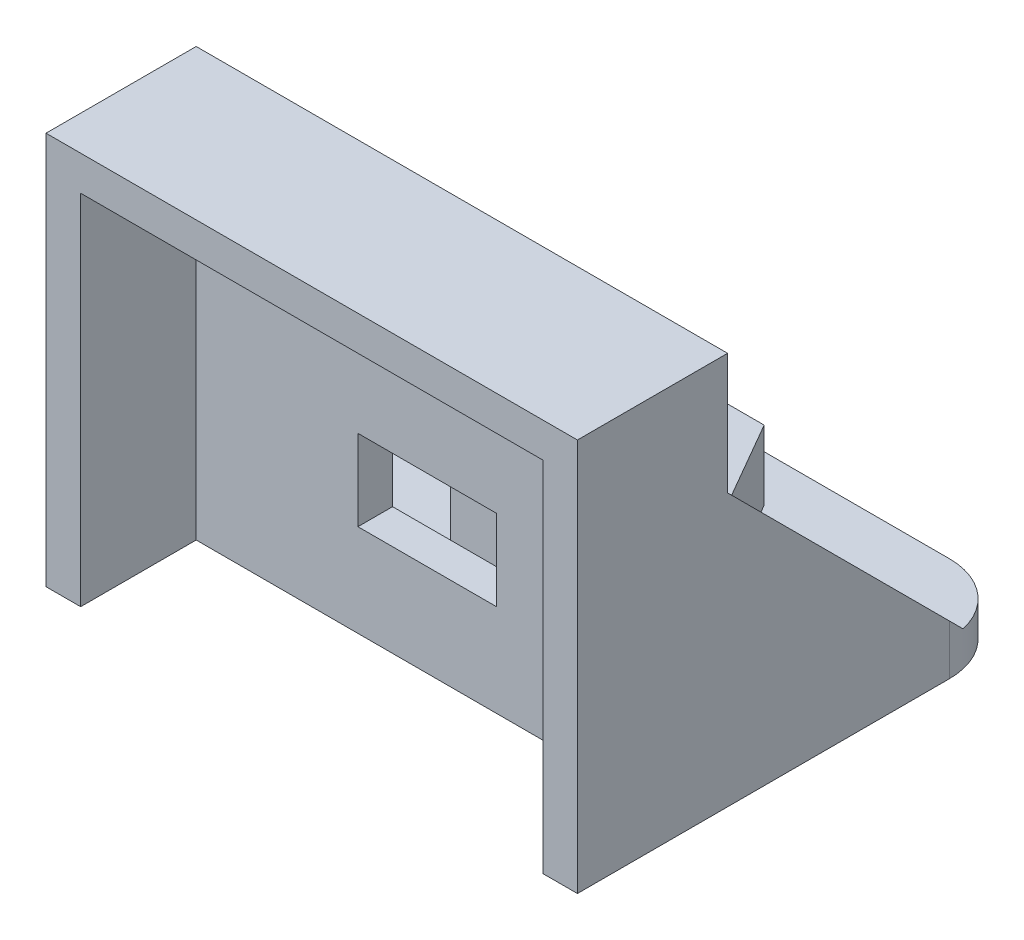
ISO-10303-21;
HEADER;
FILE_DESCRIPTION(('STEP AP214'),'2;1');
FILE_NAME('part.step','',(''),(''),'','','');
FILE_SCHEMA(('AUTOMOTIVE_DESIGN { 1 0 10303 214 1 1 1 1 }'));
ENDSEC;
DATA;
#1=APPLICATION_CONTEXT('core data for automotive mechanical design processes');
#2=APPLICATION_PROTOCOL_DEFINITION('international standard','automotive_design',2000,#1);
#3=PRODUCT_CONTEXT('',#1,'mechanical');
#4=PRODUCT('Part','Part','',(#3));
#5=PRODUCT_RELATED_PRODUCT_CATEGORY('part','',(#4));
#6=PRODUCT_DEFINITION_FORMATION('','',#4);
#7=PRODUCT_DEFINITION_CONTEXT('part definition',#1,'design');
#8=PRODUCT_DEFINITION('design','',#6,#7);
#9=PRODUCT_DEFINITION_SHAPE('','',#8);
#10=(LENGTH_UNIT() NAMED_UNIT(*) SI_UNIT(.MILLI.,.METRE.));
#11=(NAMED_UNIT(*) PLANE_ANGLE_UNIT() SI_UNIT($,.RADIAN.));
#12=(NAMED_UNIT(*) SI_UNIT($,.STERADIAN.) SOLID_ANGLE_UNIT());
#13=UNCERTAINTY_MEASURE_WITH_UNIT(LENGTH_MEASURE(1.E-05),#10,'distance_accuracy_value','');
#14=(GEOMETRIC_REPRESENTATION_CONTEXT(3) GLOBAL_UNCERTAINTY_ASSIGNED_CONTEXT((#13)) GLOBAL_UNIT_ASSIGNED_CONTEXT((#10,
#11,#12)) REPRESENTATION_CONTEXT('',''));
#15=CARTESIAN_POINT('',(0.,0.,0.));
#16=DIRECTION('',(0.,0.,1.));
#17=DIRECTION('',(1.,0.,0.));
#18=AXIS2_PLACEMENT_3D('',#15,#16,#17);
#19=CARTESIAN_POINT('',(11.5,-7.,-12.6));
#20=DIRECTION('',(0.,-1.,0.));
#21=DIRECTION('',(0.,0.,-1.));
#22=AXIS2_PLACEMENT_3D('',#19,#20,#21);
#23=PLANE('',#22);
#24=DIRECTION('',(0.5,0.,-0.866025403784439));
#25=VECTOR('',#24,1.);
#26=CARTESIAN_POINT('',(2.4826061575154,-7.,-2.));
#27=LINE('',#26,#25);
#28=CARTESIAN_POINT('',(2.4826061575154,-7.,-2.));
#29=VERTEX_POINT('',#28);
#30=CARTESIAN_POINT('',(4.96521231503081,-7.,-6.30000000000002));
#31=VERTEX_POINT('',#30);
#32=EDGE_CURVE('E357',#29,#31,#27,.T.);
#33=ORIENTED_EDGE('',*,*,#32,.F.);
#34=DIRECTION('',(1.,0.,0.));
#35=VECTOR('',#34,1.);
#36=CARTESIAN_POINT('',(-2.48260615751541,-7.,-2.));
#37=LINE('',#36,#35);
#38=CARTESIAN_POINT('',(-2.48260615751541,-7.,-2.));
#39=VERTEX_POINT('',#38);
#40=EDGE_CURVE('E362',#39,#29,#37,.T.);
#41=ORIENTED_EDGE('',*,*,#40,.F.);
#42=DIRECTION('',(0.5,0.,0.866025403784439));
#43=VECTOR('',#42,1.);
#44=CARTESIAN_POINT('',(-4.96521231503081,-7.,-6.30000000000003));
#45=LINE('',#44,#43);
#46=CARTESIAN_POINT('',(-4.96521231503081,-7.,-6.30000000000003));
#47=VERTEX_POINT('',#46);
#48=EDGE_CURVE('E384',#47,#39,#45,.T.);
#49=ORIENTED_EDGE('',*,*,#48,.F.);
#50=DIRECTION('',(-0.5,0.,0.866025403784439));
#51=VECTOR('',#50,1.);
#52=CARTESIAN_POINT('',(-2.48260615751541,-7.,-10.6));
#53=LINE('',#52,#51);
#54=CARTESIAN_POINT('',(-2.48260615751541,-7.,-10.6));
#55=VERTEX_POINT('',#54);
#56=EDGE_CURVE('E381',#55,#47,#53,.T.);
#57=ORIENTED_EDGE('',*,*,#56,.F.);
#58=DIRECTION('',(-1.,0.,0.));
#59=VECTOR('',#58,1.);
#60=CARTESIAN_POINT('',(2.4826061575154,-7.,-10.6));
#61=LINE('',#60,#59);
#62=CARTESIAN_POINT('',(2.4826061575154,-7.,-10.6));
#63=VERTEX_POINT('',#62);
#64=EDGE_CURVE('E378',#63,#55,#61,.T.);
#65=ORIENTED_EDGE('',*,*,#64,.F.);
#66=DIRECTION('',(-0.5,0.,-0.866025403784439));
#67=VECTOR('',#66,1.);
#68=CARTESIAN_POINT('',(4.96521231503081,-7.,-6.30000000000002));
#69=LINE('',#68,#67);
#70=EDGE_CURVE('E375',#31,#63,#69,.T.);
#71=ORIENTED_EDGE('',*,*,#70,.F.);
#72=EDGE_LOOP('',(#33,#41,#49,#57,#65,#71));
#73=FACE_BOUND('',#72,.T.);
#74=DIRECTION('',(1.,0.,0.));
#75=VECTOR('',#74,1.);
#76=CARTESIAN_POINT('',(11.5,-7.,-12.6));
#77=LINE('',#76,#75);
#78=CARTESIAN_POINT('',(-8.5,-7.,-12.6));
#79=VERTEX_POINT('',#78);
#80=CARTESIAN_POINT('',(8.5,-7.,-12.6));
#81=VERTEX_POINT('',#80);
#82=EDGE_CURVE('E410',#79,#81,#77,.T.);
#83=ORIENTED_EDGE('',*,*,#82,.F.);
#84=CARTESIAN_POINT('',(-8.5,-7.,-9.6));
#85=DIRECTION('',(0.,-1.,0.));
#86=DIRECTION('',(0.,0.,-1.));
#87=AXIS2_PLACEMENT_3D('',#84,#85,#86);
#88=CIRCLE('',#87,3.);
#89=CARTESIAN_POINT('',(-11.4249141286952,-7.,-10.2669912591324));
#90=VERTEX_POINT('',#89);
#91=EDGE_CURVE('E481',#79,#90,#88,.F.);
#92=ORIENTED_EDGE('',*,*,#91,.T.);
#93=DIRECTION('',(-1.,0.,0.));
#94=VECTOR('',#93,1.);
#95=CARTESIAN_POINT('',(-10.,-7.,-10.2669912591324));
#96=LINE('',#95,#94);
#97=CARTESIAN_POINT('',(-10.,-7.,-10.2669912591324));
#98=VERTEX_POINT('',#97);
#99=EDGE_CURVE('E285',#98,#90,#96,.T.);
#100=ORIENTED_EDGE('',*,*,#99,.F.);
#101=DIRECTION('',(0.,0.,-1.));
#102=VECTOR('',#101,1.);
#103=CARTESIAN_POINT('',(-10.,-7.,-8.894310991121));
#104=LINE('',#103,#102);
#105=CARTESIAN_POINT('',(-10.,-7.00000000000001,0.));
#106=VERTEX_POINT('',#105);
#107=EDGE_CURVE('E288',#106,#98,#104,.T.);
#108=ORIENTED_EDGE('',*,*,#107,.F.);
#109=DIRECTION('',(1.,0.,0.));
#110=VECTOR('',#109,1.);
#111=CARTESIAN_POINT('',(11.5,-7.,0.));
#112=LINE('',#111,#110);
#113=CARTESIAN_POINT('',(10.,-7.,0.));
#114=VERTEX_POINT('',#113);
#115=EDGE_CURVE('E406',#106,#114,#112,.T.);
#116=ORIENTED_EDGE('',*,*,#115,.T.);
#117=DIRECTION('',(0.,0.,-1.));
#118=VECTOR('',#117,1.);
#119=CARTESIAN_POINT('',(10.,-7.,-8.894310991121));
#120=LINE('',#119,#118);
#121=CARTESIAN_POINT('',(10.,-7.,-10.2669912591324));
#122=VERTEX_POINT('',#121);
#123=EDGE_CURVE('E301',#114,#122,#120,.T.);
#124=ORIENTED_EDGE('',*,*,#123,.T.);
#125=DIRECTION('',(1.,0.,0.));
#126=VECTOR('',#125,1.);
#127=CARTESIAN_POINT('',(10.,-7.,-10.2669912591324));
#128=LINE('',#127,#126);
#129=CARTESIAN_POINT('',(11.4249141286952,-7.,-10.2669912591324));
#130=VERTEX_POINT('',#129);
#131=EDGE_CURVE('E304',#122,#130,#128,.T.);
#132=ORIENTED_EDGE('',*,*,#131,.T.);
#133=CARTESIAN_POINT('',(8.5,-7.,-9.6));
#134=DIRECTION('',(0.,-1.,0.));
#135=DIRECTION('',(0.,0.,-1.));
#136=AXIS2_PLACEMENT_3D('',#133,#134,#135);
#137=CIRCLE('',#136,3.);
#138=EDGE_CURVE('E479',#130,#81,#137,.F.);
#139=ORIENTED_EDGE('',*,*,#138,.T.);
#140=EDGE_LOOP('',(#83,#92,#100,#108,#116,#124,#132,#139));
#141=FACE_BOUND('',#140,.T.);
#142=ADVANCED_FACE('F33',(#73,#141),#23,.F.);
#143=CARTESIAN_POINT('',(0.,0.,0.));
#144=DIRECTION('',(0.,0.,1.));
#145=DIRECTION('',(1.,0.,0.));
#146=AXIS2_PLACEMENT_3D('',#143,#144,#145);
#147=PLANE('',#146);
#148=DIRECTION('',(-1.,0.,0.));
#149=VECTOR('',#148,1.);
#150=CARTESIAN_POINT('',(2.99999999999999,-4.5,0.));
#151=LINE('',#150,#149);
#152=CARTESIAN_POINT('',(2.99999999999999,-4.5,0.));
#153=VERTEX_POINT('',#152);
#154=CARTESIAN_POINT('',(-3.00000000000001,-4.5,0.));
#155=VERTEX_POINT('',#154);
#156=EDGE_CURVE('E260',#153,#155,#151,.T.);
#157=ORIENTED_EDGE('',*,*,#156,.F.);
#158=DIRECTION('',(0.,-1.,0.));
#159=VECTOR('',#158,1.);
#160=CARTESIAN_POINT('',(2.99999999999999,-1.,0.));
#161=LINE('',#160,#159);
#162=CARTESIAN_POINT('',(2.99999999999999,-1.,0.));
#163=VERTEX_POINT('',#162);
#164=EDGE_CURVE('E48',#163,#153,#161,.T.);
#165=ORIENTED_EDGE('',*,*,#164,.F.);
#166=DIRECTION('',(1.,0.,0.));
#167=VECTOR('',#166,1.);
#168=CARTESIAN_POINT('',(2.99999999999999,-1.,0.));
#169=LINE('',#168,#167);
#170=CARTESIAN_POINT('',(-3.00000000000001,-1.,0.));
#171=VERTEX_POINT('',#170);
#172=EDGE_CURVE('E253',#171,#163,#169,.T.);
#173=ORIENTED_EDGE('',*,*,#172,.F.);
#174=DIRECTION('',(0.,1.,0.));
#175=VECTOR('',#174,1.);
#176=CARTESIAN_POINT('',(-3.00000000000001,-1.,0.));
#177=LINE('',#176,#175);
#178=EDGE_CURVE('E267',#155,#171,#177,.T.);
#179=ORIENTED_EDGE('',*,*,#178,.F.);
#180=EDGE_LOOP('',(#157,#165,#173,#179));
#181=FACE_BOUND('',#180,.T.);
#182=DIRECTION('',(0.,1.,0.));
#183=VECTOR('',#182,1.);
#184=CARTESIAN_POINT('',(-10.,1.89431099112099,0.));
#185=LINE('',#184,#183);
#186=CARTESIAN_POINT('',(-10.,3.26699125913235,0.));
#187=VERTEX_POINT('',#186);
#188=EDGE_CURVE('E281',#106,#187,#185,.T.);
#189=ORIENTED_EDGE('',*,*,#188,.T.);
#190=DIRECTION('',(-1.,0.,0.));
#191=VECTOR('',#190,1.);
#192=CARTESIAN_POINT('',(-10.,3.26699125913235,0.));
#193=LINE('',#192,#191);
#194=CARTESIAN_POINT('',(-11.5,3.26699125913235,0.));
#195=VERTEX_POINT('',#194);
#196=EDGE_CURVE('E282',#187,#195,#193,.T.);
#197=ORIENTED_EDGE('',*,*,#196,.T.);
#198=DIRECTION('',(0.,-1.,0.));
#199=VECTOR('',#198,1.);
#200=CARTESIAN_POINT('',(-11.5,8.5,0.));
#201=LINE('',#200,#199);
#202=CARTESIAN_POINT('',(-11.5,8.5,0.));
#203=VERTEX_POINT('',#202);
#204=EDGE_CURVE('E448',#203,#195,#201,.T.);
#205=ORIENTED_EDGE('',*,*,#204,.F.);
#206=DIRECTION('',(-1.,0.,0.));
#207=VECTOR('',#206,1.);
#208=CARTESIAN_POINT('',(-11.5,8.5,0.));
#209=LINE('',#208,#207);
#210=CARTESIAN_POINT('',(11.5,8.5,0.));
#211=VERTEX_POINT('',#210);
#212=EDGE_CURVE('E458',#211,#203,#209,.T.);
#213=ORIENTED_EDGE('',*,*,#212,.F.);
#214=DIRECTION('',(0.,1.,0.));
#215=VECTOR('',#214,1.);
#216=CARTESIAN_POINT('',(11.5,8.5,0.));
#217=LINE('',#216,#215);
#218=CARTESIAN_POINT('',(11.5,3.26699125913235,0.));
#219=VERTEX_POINT('',#218);
#220=EDGE_CURVE('E436',#219,#211,#217,.T.);
#221=ORIENTED_EDGE('',*,*,#220,.F.);
#222=DIRECTION('',(1.,0.,0.));
#223=VECTOR('',#222,1.);
#224=CARTESIAN_POINT('',(10.,3.26699125913235,0.));
#225=LINE('',#224,#223);
#226=CARTESIAN_POINT('',(10.,3.26699125913235,0.));
#227=VERTEX_POINT('',#226);
#228=EDGE_CURVE('E297',#227,#219,#225,.T.);
#229=ORIENTED_EDGE('',*,*,#228,.F.);
#230=DIRECTION('',(0.,1.,0.));
#231=VECTOR('',#230,1.);
#232=CARTESIAN_POINT('',(10.,1.89431099112099,0.));
#233=LINE('',#232,#231);
#234=EDGE_CURVE('E298',#114,#227,#233,.T.);
#235=ORIENTED_EDGE('',*,*,#234,.F.);
#236=ORIENTED_EDGE('',*,*,#115,.F.);
#237=EDGE_LOOP('',(#189,#197,#205,#213,#221,#229,#235,#236));
#238=FACE_BOUND('',#237,.T.);
#239=ADVANCED_FACE('F527',(#181,#238),#147,.F.);
#240=CARTESIAN_POINT('',(11.5,8.5,6.5));
#241=DIRECTION('',(-1.,0.,0.));
#242=DIRECTION('',(0.,-1.,0.));
#243=AXIS2_PLACEMENT_3D('',#240,#241,#242);
#244=PLANE('',#243);
#245=DIRECTION('',(0.,0.,-1.));
#246=VECTOR('',#245,1.);
#247=CARTESIAN_POINT('',(11.5,-8.5,6.5));
#248=LINE('',#247,#246);
#249=CARTESIAN_POINT('',(11.5,-8.5,6.5));
#250=VERTEX_POINT('',#249);
#251=CARTESIAN_POINT('',(11.5,-8.5,-9.59999999999999));
#252=VERTEX_POINT('',#251);
#253=EDGE_CURVE('E456',#250,#252,#248,.T.);
#254=ORIENTED_EDGE('',*,*,#253,.T.);
#255=DIRECTION('',(0.,-1.,0.));
#256=VECTOR('',#255,1.);
#257=CARTESIAN_POINT('',(11.5,-7.,-9.6));
#258=LINE('',#257,#256);
#259=CARTESIAN_POINT('',(11.5,-6.33300874086764,-9.6));
#260=VERTEX_POINT('',#259);
#261=EDGE_CURVE('E41',#252,#260,#258,.F.);
#262=ORIENTED_EDGE('',*,*,#261,.T.);
#263=DIRECTION('',(0.,0.707106781186547,0.707106781186548));
#264=VECTOR('',#263,1.);
#265=CARTESIAN_POINT('',(11.5,-10.7608153615548,-14.0278066206872));
#266=LINE('',#265,#264);
#267=EDGE_CURVE('E307',#260,#219,#266,.T.);
#268=ORIENTED_EDGE('',*,*,#267,.T.);
#269=ORIENTED_EDGE('',*,*,#220,.T.);
#270=DIRECTION('',(0.,0.,-1.));
#271=VECTOR('',#270,1.);
#272=CARTESIAN_POINT('',(11.5,8.5,6.5));
#273=LINE('',#272,#271);
#274=CARTESIAN_POINT('',(11.5,8.5,6.5));
#275=VERTEX_POINT('',#274);
#276=EDGE_CURVE('E470',#275,#211,#273,.T.);
#277=ORIENTED_EDGE('',*,*,#276,.F.);
#278=DIRECTION('',(0.,1.,0.));
#279=VECTOR('',#278,1.);
#280=CARTESIAN_POINT('',(11.5,8.5,6.5));
#281=LINE('',#280,#279);
#282=EDGE_CURVE('E444',#250,#275,#281,.T.);
#283=ORIENTED_EDGE('',*,*,#282,.F.);
#284=EDGE_LOOP('',(#254,#262,#268,#269,#277,#283));
#285=FACE_BOUND('',#284,.T.);
#286=ADVANCED_FACE('F493',(#285),#244,.F.);
#287=CARTESIAN_POINT('',(-11.5,8.5,6.5));
#288=DIRECTION('',(0.,-1.,0.));
#289=DIRECTION('',(0.,0.,-1.));
#290=AXIS2_PLACEMENT_3D('',#287,#288,#289);
#291=PLANE('',#290);
#292=ORIENTED_EDGE('',*,*,#212,.T.);
#293=DIRECTION('',(0.,0.,-1.));
#294=VECTOR('',#293,1.);
#295=CARTESIAN_POINT('',(-11.5,8.5,6.5));
#296=LINE('',#295,#294);
#297=CARTESIAN_POINT('',(-11.5,8.5,6.5));
#298=VERTEX_POINT('',#297);
#299=EDGE_CURVE('E467',#298,#203,#296,.T.);
#300=ORIENTED_EDGE('',*,*,#299,.F.);
#301=DIRECTION('',(-1.,0.,0.));
#302=VECTOR('',#301,1.);
#303=CARTESIAN_POINT('',(-11.5,8.5,6.5));
#304=LINE('',#303,#302);
#305=EDGE_CURVE('E447',#275,#298,#304,.T.);
#306=ORIENTED_EDGE('',*,*,#305,.F.);
#307=ORIENTED_EDGE('',*,*,#276,.T.);
#308=EDGE_LOOP('',(#292,#300,#306,#307));
#309=FACE_BOUND('',#308,.T.);
#310=ADVANCED_FACE('F659',(#309),#291,.F.);
#311=CARTESIAN_POINT('',(-11.5,8.5,6.5));
#312=DIRECTION('',(1.,0.,0.));
#313=DIRECTION('',(0.,1.,0.));
#314=AXIS2_PLACEMENT_3D('',#311,#312,#313);
#315=PLANE('',#314);
#316=DIRECTION('',(0.,0.707106781186547,0.707106781186548));
#317=VECTOR('',#316,1.);
#318=CARTESIAN_POINT('',(-11.5,-10.7608153615548,-14.0278066206872));
#319=LINE('',#318,#317);
#320=CARTESIAN_POINT('',(-11.5,-6.33300874086764,-9.6));
#321=VERTEX_POINT('',#320);
#322=EDGE_CURVE('E292',#321,#195,#319,.T.);
#323=ORIENTED_EDGE('',*,*,#322,.F.);
#324=DIRECTION('',(0.,1.,0.));
#325=VECTOR('',#324,1.);
#326=CARTESIAN_POINT('',(-11.5,-8.5,-9.6));
#327=LINE('',#326,#325);
#328=CARTESIAN_POINT('',(-11.5,-8.5,-9.59999999999999));
#329=VERTEX_POINT('',#328);
#330=EDGE_CURVE('E485',#321,#329,#327,.F.);
#331=ORIENTED_EDGE('',*,*,#330,.T.);
#332=DIRECTION('',(0.,0.,-1.));
#333=VECTOR('',#332,1.);
#334=CARTESIAN_POINT('',(-11.5,-8.5,6.5));
#335=LINE('',#334,#333);
#336=CARTESIAN_POINT('',(-11.5,-8.5,6.5));
#337=VERTEX_POINT('',#336);
#338=EDGE_CURVE('E464',#337,#329,#335,.T.);
#339=ORIENTED_EDGE('',*,*,#338,.F.);
#340=DIRECTION('',(0.,-1.,0.));
#341=VECTOR('',#340,1.);
#342=CARTESIAN_POINT('',(-11.5,8.5,6.5));
#343=LINE('',#342,#341);
#344=EDGE_CURVE('E450',#298,#337,#343,.T.);
#345=ORIENTED_EDGE('',*,*,#344,.F.);
#346=ORIENTED_EDGE('',*,*,#299,.T.);
#347=ORIENTED_EDGE('',*,*,#204,.T.);
#348=EDGE_LOOP('',(#323,#331,#339,#345,#346,#347));
#349=FACE_BOUND('',#348,.T.);
#350=ADVANCED_FACE('F655',(#349),#315,.F.);
#351=CARTESIAN_POINT('',(-11.5,-8.5,6.5));
#352=DIRECTION('',(0.,1.,0.));
#353=DIRECTION('',(0.,0.,1.));
#354=AXIS2_PLACEMENT_3D('',#351,#352,#353);
#355=PLANE('',#354);
#356=CARTESIAN_POINT('',(0.,-8.5,-6.30000000000002));
#357=DIRECTION('',(0.,1.,0.));
#358=DIRECTION('',(0.,0.,1.));
#359=AXIS2_PLACEMENT_3D('',#356,#357,#358);
#360=CIRCLE('',#359,1.6);
#361=CARTESIAN_POINT('',(0.,-8.5,-4.70000000000003));
#362=VERTEX_POINT('',#361);
#363=EDGE_CURVE('E278',#362,#362,#360,.T.);
#364=ORIENTED_EDGE('',*,*,#363,.T.);
#365=EDGE_LOOP('',(#364));
#366=FACE_BOUND('',#365,.T.);
#367=ORIENTED_EDGE('',*,*,#338,.T.);
#368=CARTESIAN_POINT('',(-8.5,-8.5,-9.6));
#369=DIRECTION('',(0.,1.,0.));
#370=DIRECTION('',(0.,0.,1.));
#371=AXIS2_PLACEMENT_3D('',#368,#369,#370);
#372=CIRCLE('',#371,3.);
#373=CARTESIAN_POINT('',(-8.5,-8.5,-12.6));
#374=VERTEX_POINT('',#373);
#375=EDGE_CURVE('E489',#329,#374,#372,.F.);
#376=ORIENTED_EDGE('',*,*,#375,.T.);
#377=DIRECTION('',(-1.,0.,0.));
#378=VECTOR('',#377,1.);
#379=CARTESIAN_POINT('',(11.5,-8.5,-12.6));
#380=LINE('',#379,#378);
#381=CARTESIAN_POINT('',(8.5,-8.5,-12.6));
#382=VERTEX_POINT('',#381);
#383=EDGE_CURVE('E407',#382,#374,#380,.T.);
#384=ORIENTED_EDGE('',*,*,#383,.F.);
#385=CARTESIAN_POINT('',(8.5,-8.5,-9.6));
#386=DIRECTION('',(0.,1.,0.));
#387=DIRECTION('',(0.,0.,1.));
#388=AXIS2_PLACEMENT_3D('',#385,#386,#387);
#389=CIRCLE('',#388,3.);
#390=EDGE_CURVE('E487',#382,#252,#389,.F.);
#391=ORIENTED_EDGE('',*,*,#390,.T.);
#392=ORIENTED_EDGE('',*,*,#253,.F.);
#393=DIRECTION('',(1.,0.,0.));
#394=VECTOR('',#393,1.);
#395=CARTESIAN_POINT('',(-11.5,-8.5,6.5));
#396=LINE('',#395,#394);
#397=CARTESIAN_POINT('',(10.,-8.5,6.5));
#398=VERTEX_POINT('',#397);
#399=EDGE_CURVE('E452',#398,#250,#396,.T.);
#400=ORIENTED_EDGE('',*,*,#399,.F.);
#401=DIRECTION('',(0.,0.,1.));
#402=VECTOR('',#401,1.);
#403=CARTESIAN_POINT('',(10.,-8.5,1.5));
#404=LINE('',#403,#402);
#405=CARTESIAN_POINT('',(10.,-8.5,1.5));
#406=VERTEX_POINT('',#405);
#407=EDGE_CURVE('E434',#406,#398,#404,.T.);
#408=ORIENTED_EDGE('',*,*,#407,.F.);
#409=DIRECTION('',(1.,0.,0.));
#410=VECTOR('',#409,1.);
#411=CARTESIAN_POINT('',(-10.,-8.5,1.5));
#412=LINE('',#411,#410);
#413=CARTESIAN_POINT('',(-10.,-8.5,1.5));
#414=VERTEX_POINT('',#413);
#415=EDGE_CURVE('E425',#414,#406,#412,.T.);
#416=ORIENTED_EDGE('',*,*,#415,.F.);
#417=DIRECTION('',(0.,0.,1.));
#418=VECTOR('',#417,1.);
#419=CARTESIAN_POINT('',(-10.,-8.5,1.5));
#420=LINE('',#419,#418);
#421=CARTESIAN_POINT('',(-10.,-8.5,6.5));
#422=VERTEX_POINT('',#421);
#423=EDGE_CURVE('E437',#414,#422,#420,.T.);
#424=ORIENTED_EDGE('',*,*,#423,.T.);
#425=EDGE_CURVE('E453',#337,#422,#396,.T.);
#426=ORIENTED_EDGE('',*,*,#425,.F.);
#427=EDGE_LOOP('',(#367,#376,#384,#391,#392,#400,#408,#416,#424,#426));
#428=FACE_BOUND('',#427,.T.);
#429=ADVANCED_FACE('F650',(#366,#428),#355,.F.);
#430=CARTESIAN_POINT('',(0.,0.,6.5));
#431=DIRECTION('',(0.,0.,1.));
#432=DIRECTION('',(1.,0.,0.));
#433=AXIS2_PLACEMENT_3D('',#430,#431,#432);
#434=PLANE('',#433);
#435=DIRECTION('',(0.,1.,0.));
#436=VECTOR('',#435,1.);
#437=CARTESIAN_POINT('',(10.,7.,6.5));
#438=LINE('',#437,#436);
#439=CARTESIAN_POINT('',(10.,7.,6.5));
#440=VERTEX_POINT('',#439);
#441=EDGE_CURVE('E413',#398,#440,#438,.T.);
#442=ORIENTED_EDGE('',*,*,#441,.F.);
#443=ORIENTED_EDGE('',*,*,#399,.T.);
#444=ORIENTED_EDGE('',*,*,#282,.T.);
#445=ORIENTED_EDGE('',*,*,#305,.T.);
#446=ORIENTED_EDGE('',*,*,#344,.T.);
#447=ORIENTED_EDGE('',*,*,#425,.T.);
#448=DIRECTION('',(0.,-1.,0.));
#449=VECTOR('',#448,1.);
#450=CARTESIAN_POINT('',(-10.,7.,6.5));
#451=LINE('',#450,#449);
#452=CARTESIAN_POINT('',(-10.,7.,6.5));
#453=VERTEX_POINT('',#452);
#454=EDGE_CURVE('E419',#453,#422,#451,.T.);
#455=ORIENTED_EDGE('',*,*,#454,.F.);
#456=DIRECTION('',(-1.,0.,0.));
#457=VECTOR('',#456,1.);
#458=CARTESIAN_POINT('',(-10.,7.,6.5));
#459=LINE('',#458,#457);
#460=EDGE_CURVE('E430',#440,#453,#459,.T.);
#461=ORIENTED_EDGE('',*,*,#460,.F.);
#462=EDGE_LOOP('',(#442,#443,#444,#445,#446,#447,#455,#461));
#463=FACE_BOUND('',#462,.T.);
#464=ADVANCED_FACE('F647',(#463),#434,.T.);
#465=CARTESIAN_POINT('',(10.,7.,1.5));
#466=DIRECTION('',(1.,0.,0.));
#467=DIRECTION('',(0.,1.,0.));
#468=AXIS2_PLACEMENT_3D('',#465,#466,#467);
#469=PLANE('',#468);
#470=ORIENTED_EDGE('',*,*,#441,.T.);
#471=DIRECTION('',(0.,0.,1.));
#472=VECTOR('',#471,1.);
#473=CARTESIAN_POINT('',(10.,7.,1.5));
#474=LINE('',#473,#472);
#475=CARTESIAN_POINT('',(10.,7.,1.5));
#476=VERTEX_POINT('',#475);
#477=EDGE_CURVE('E428',#476,#440,#474,.T.);
#478=ORIENTED_EDGE('',*,*,#477,.F.);
#479=DIRECTION('',(0.,1.,0.));
#480=VECTOR('',#479,1.);
#481=CARTESIAN_POINT('',(10.,7.,1.5));
#482=LINE('',#481,#480);
#483=EDGE_CURVE('E415',#406,#476,#482,.T.);
#484=ORIENTED_EDGE('',*,*,#483,.F.);
#485=ORIENTED_EDGE('',*,*,#407,.T.);
#486=EDGE_LOOP('',(#470,#478,#484,#485));
#487=FACE_BOUND('',#486,.T.);
#488=ADVANCED_FACE('F642',(#487),#469,.F.);
#489=CARTESIAN_POINT('',(-10.,7.,1.5));
#490=DIRECTION('',(-1.,0.,0.));
#491=DIRECTION('',(0.,0.,1.));
#492=AXIS2_PLACEMENT_3D('',#489,#490,#491);
#493=PLANE('',#492);
#494=ORIENTED_EDGE('',*,*,#454,.T.);
#495=ORIENTED_EDGE('',*,*,#423,.F.);
#496=DIRECTION('',(0.,-1.,0.));
#497=VECTOR('',#496,1.);
#498=CARTESIAN_POINT('',(-10.,7.,1.5));
#499=LINE('',#498,#497);
#500=CARTESIAN_POINT('',(-10.,7.,1.5));
#501=VERTEX_POINT('',#500);
#502=EDGE_CURVE('E422',#501,#414,#499,.T.);
#503=ORIENTED_EDGE('',*,*,#502,.F.);
#504=DIRECTION('',(0.,0.,1.));
#505=VECTOR('',#504,1.);
#506=CARTESIAN_POINT('',(-10.,7.,1.5));
#507=LINE('',#506,#505);
#508=EDGE_CURVE('E440',#501,#453,#507,.T.);
#509=ORIENTED_EDGE('',*,*,#508,.T.);
#510=EDGE_LOOP('',(#494,#495,#503,#509));
#511=FACE_BOUND('',#510,.T.);
#512=ADVANCED_FACE('F637',(#511),#493,.F.);
#513=CARTESIAN_POINT('',(-10.,7.,1.5));
#514=DIRECTION('',(0.,1.,0.));
#515=DIRECTION('',(0.,0.,1.));
#516=AXIS2_PLACEMENT_3D('',#513,#514,#515);
#517=PLANE('',#516);
#518=ORIENTED_EDGE('',*,*,#460,.T.);
#519=ORIENTED_EDGE('',*,*,#508,.F.);
#520=DIRECTION('',(-1.,0.,0.));
#521=VECTOR('',#520,1.);
#522=CARTESIAN_POINT('',(-10.,7.,1.5));
#523=LINE('',#522,#521);
#524=EDGE_CURVE('E418',#476,#501,#523,.T.);
#525=ORIENTED_EDGE('',*,*,#524,.F.);
#526=ORIENTED_EDGE('',*,*,#477,.T.);
#527=EDGE_LOOP('',(#518,#519,#525,#526));
#528=FACE_BOUND('',#527,.T.);
#529=ADVANCED_FACE('F633',(#528),#517,.F.);
#530=CARTESIAN_POINT('',(0.,0.,1.5));
#531=DIRECTION('',(0.,0.,1.));
#532=DIRECTION('',(1.,0.,0.));
#533=AXIS2_PLACEMENT_3D('',#530,#531,#532);
#534=PLANE('',#533);
#535=DIRECTION('',(0.,-1.,0.));
#536=VECTOR('',#535,1.);
#537=CARTESIAN_POINT('',(2.99999999999999,-1.,1.5));
#538=LINE('',#537,#536);
#539=CARTESIAN_POINT('',(2.99999999999999,-1.,1.5));
#540=VERTEX_POINT('',#539);
#541=CARTESIAN_POINT('',(2.99999999999999,-4.5,1.5));
#542=VERTEX_POINT('',#541);
#543=EDGE_CURVE('E251',#540,#542,#538,.T.);
#544=ORIENTED_EDGE('',*,*,#543,.T.);
#545=DIRECTION('',(-1.,0.,0.));
#546=VECTOR('',#545,1.);
#547=CARTESIAN_POINT('',(2.99999999999999,-4.5,1.5));
#548=LINE('',#547,#546);
#549=CARTESIAN_POINT('',(-3.00000000000001,-4.5,1.5));
#550=VERTEX_POINT('',#549);
#551=EDGE_CURVE('E240',#542,#550,#548,.T.);
#552=ORIENTED_EDGE('',*,*,#551,.T.);
#553=DIRECTION('',(0.,1.,0.));
#554=VECTOR('',#553,1.);
#555=CARTESIAN_POINT('',(-3.00000000000001,-1.,1.5));
#556=LINE('',#555,#554);
#557=CARTESIAN_POINT('',(-3.00000000000001,-1.,1.5));
#558=VERTEX_POINT('',#557);
#559=EDGE_CURVE('E262',#550,#558,#556,.T.);
#560=ORIENTED_EDGE('',*,*,#559,.T.);
#561=DIRECTION('',(1.,0.,0.));
#562=VECTOR('',#561,1.);
#563=CARTESIAN_POINT('',(2.99999999999999,-1.,1.5));
#564=LINE('',#563,#562);
#565=EDGE_CURVE('E258',#558,#540,#564,.T.);
#566=ORIENTED_EDGE('',*,*,#565,.T.);
#567=EDGE_LOOP('',(#544,#552,#560,#566));
#568=FACE_BOUND('',#567,.T.);
#569=ORIENTED_EDGE('',*,*,#483,.T.);
#570=ORIENTED_EDGE('',*,*,#524,.T.);
#571=ORIENTED_EDGE('',*,*,#502,.T.);
#572=ORIENTED_EDGE('',*,*,#415,.T.);
#573=EDGE_LOOP('',(#569,#570,#571,#572));
#574=FACE_BOUND('',#573,.T.);
#575=ADVANCED_FACE('F256',(#568,#574),#534,.T.);
#576=CARTESIAN_POINT('',(0.,0.,-12.6));
#577=DIRECTION('',(0.,0.,-1.));
#578=DIRECTION('',(-1.,0.,0.));
#579=AXIS2_PLACEMENT_3D('',#576,#577,#578);
#580=PLANE('',#579);
#581=ORIENTED_EDGE('',*,*,#383,.T.);
#582=DIRECTION('',(0.,1.,0.));
#583=VECTOR('',#582,1.);
#584=CARTESIAN_POINT('',(-8.5,-7.,-12.6));
#585=LINE('',#584,#583);
#586=EDGE_CURVE('E476',#374,#79,#585,.T.);
#587=ORIENTED_EDGE('',*,*,#586,.T.);
#588=ORIENTED_EDGE('',*,*,#82,.T.);
#589=DIRECTION('',(0.,-1.,0.));
#590=VECTOR('',#589,1.);
#591=CARTESIAN_POINT('',(8.5,-8.5,-12.6));
#592=LINE('',#591,#590);
#593=EDGE_CURVE('E473',#81,#382,#592,.T.);
#594=ORIENTED_EDGE('',*,*,#593,.T.);
#595=EDGE_LOOP('',(#581,#587,#588,#594));
#596=FACE_BOUND('',#595,.T.);
#597=ADVANCED_FACE('F507',(#596),#580,.T.);
#598=CARTESIAN_POINT('',(0.,-4.,0.));
#599=DIRECTION('',(0.,1.,0.));
#600=DIRECTION('',(0.,0.,1.));
#601=AXIS2_PLACEMENT_3D('',#598,#599,#600);
#602=PLANE('',#601);
#603=DIRECTION('',(0.5,0.,-0.866025403784439));
#604=VECTOR('',#603,1.);
#605=CARTESIAN_POINT('',(2.4826061575154,-4.,-2.));
#606=LINE('',#605,#604);
#607=CARTESIAN_POINT('',(2.4826061575154,-4.,-2.));
#608=VERTEX_POINT('',#607);
#609=CARTESIAN_POINT('',(4.96521231503081,-4.,-6.30000000000002));
#610=VERTEX_POINT('',#609);
#611=EDGE_CURVE('E358',#608,#610,#606,.T.);
#612=ORIENTED_EDGE('',*,*,#611,.T.);
#613=DIRECTION('',(-0.5,0.,-0.866025403784439));
#614=VECTOR('',#613,1.);
#615=CARTESIAN_POINT('',(4.96521231503081,-4.,-6.30000000000002));
#616=LINE('',#615,#614);
#617=CARTESIAN_POINT('',(2.4826061575154,-4.,-10.6));
#618=VERTEX_POINT('',#617);
#619=EDGE_CURVE('E361',#610,#618,#616,.T.);
#620=ORIENTED_EDGE('',*,*,#619,.T.);
#621=DIRECTION('',(-1.,0.,0.));
#622=VECTOR('',#621,1.);
#623=CARTESIAN_POINT('',(2.4826061575154,-4.,-10.6));
#624=LINE('',#623,#622);
#625=CARTESIAN_POINT('',(-2.48260615751541,-4.,-10.6));
#626=VERTEX_POINT('',#625);
#627=EDGE_CURVE('E364',#618,#626,#624,.T.);
#628=ORIENTED_EDGE('',*,*,#627,.T.);
#629=DIRECTION('',(-0.5,0.,0.866025403784439));
#630=VECTOR('',#629,1.);
#631=CARTESIAN_POINT('',(-2.48260615751541,-4.,-10.6));
#632=LINE('',#631,#630);
#633=CARTESIAN_POINT('',(-4.96521231503081,-4.,-6.30000000000003));
#634=VERTEX_POINT('',#633);
#635=EDGE_CURVE('E366',#626,#634,#632,.T.);
#636=ORIENTED_EDGE('',*,*,#635,.T.);
#637=DIRECTION('',(0.5,0.,0.866025403784439));
#638=VECTOR('',#637,1.);
#639=CARTESIAN_POINT('',(-4.96521231503081,-4.,-6.30000000000003));
#640=LINE('',#639,#638);
#641=CARTESIAN_POINT('',(-2.48260615751541,-4.,-2.));
#642=VERTEX_POINT('',#641);
#643=EDGE_CURVE('E368',#634,#642,#640,.T.);
#644=ORIENTED_EDGE('',*,*,#643,.T.);
#645=DIRECTION('',(1.,0.,0.));
#646=VECTOR('',#645,1.);
#647=CARTESIAN_POINT('',(-2.48260615751541,-4.,-2.));
#648=LINE('',#647,#646);
#649=EDGE_CURVE('E370',#642,#608,#648,.T.);
#650=ORIENTED_EDGE('',*,*,#649,.T.);
#651=EDGE_LOOP('',(#612,#620,#628,#636,#644,#650));
#652=FACE_BOUND('',#651,.T.);
#653=DIRECTION('',(-0.5,0.,-0.866025403784439));
#654=VECTOR('',#653,1.);
#655=CARTESIAN_POINT('',(3.23316150746193,-4.,-6.30000000000002));
#656=LINE('',#655,#654);
#657=CARTESIAN_POINT('',(3.23316150746193,-4.,-6.30000000000002));
#658=VERTEX_POINT('',#657);
#659=CARTESIAN_POINT('',(1.61658075373096,-4.,-9.10000000000005));
#660=VERTEX_POINT('',#659);
#661=EDGE_CURVE('E316',#658,#660,#656,.T.);
#662=ORIENTED_EDGE('',*,*,#661,.F.);
#663=DIRECTION('',(0.5,0.,-0.866025403784438));
#664=VECTOR('',#663,1.);
#665=CARTESIAN_POINT('',(1.61658075373097,-4.,-3.5));
#666=LINE('',#665,#664);
#667=CARTESIAN_POINT('',(1.61658075373097,-4.,-3.5));
#668=VERTEX_POINT('',#667);
#669=EDGE_CURVE('E314',#668,#658,#666,.T.);
#670=ORIENTED_EDGE('',*,*,#669,.F.);
#671=DIRECTION('',(1.,0.,0.));
#672=VECTOR('',#671,1.);
#673=CARTESIAN_POINT('',(-1.61658075373097,-4.,-3.5));
#674=LINE('',#673,#672);
#675=CARTESIAN_POINT('',(-1.61658075373097,-4.,-3.5));
#676=VERTEX_POINT('',#675);
#677=EDGE_CURVE('E326',#676,#668,#674,.T.);
#678=ORIENTED_EDGE('',*,*,#677,.F.);
#679=DIRECTION('',(0.5,0.,0.866025403784439));
#680=VECTOR('',#679,1.);
#681=CARTESIAN_POINT('',(-3.23316150746193,-4.,-6.30000000000003));
#682=LINE('',#681,#680);
#683=CARTESIAN_POINT('',(-3.23316150746193,-4.,-6.30000000000003));
#684=VERTEX_POINT('',#683);
#685=EDGE_CURVE('E323',#684,#676,#682,.T.);
#686=ORIENTED_EDGE('',*,*,#685,.F.);
#687=DIRECTION('',(-0.5,0.,0.866025403784439));
#688=VECTOR('',#687,1.);
#689=CARTESIAN_POINT('',(-1.61658075373097,-4.,-9.10000000000005));
#690=LINE('',#689,#688);
#691=CARTESIAN_POINT('',(-1.61658075373097,-4.,-9.10000000000005));
#692=VERTEX_POINT('',#691);
#693=EDGE_CURVE('E321',#692,#684,#690,.T.);
#694=ORIENTED_EDGE('',*,*,#693,.F.);
#695=DIRECTION('',(-1.,0.,0.));
#696=VECTOR('',#695,1.);
#697=CARTESIAN_POINT('',(1.61658075373096,-4.,-9.10000000000005));
#698=LINE('',#697,#696);
#699=EDGE_CURVE('E319',#660,#692,#698,.T.);
#700=ORIENTED_EDGE('',*,*,#699,.F.);
#701=EDGE_LOOP('',(#662,#670,#678,#686,#694,#700));
#702=FACE_BOUND('',#701,.T.);
#703=ADVANCED_FACE('F577',(#652,#702),#602,.T.);
#704=CARTESIAN_POINT('',(2.4826061575154,-4.,-2.));
#705=DIRECTION('',(-0.866025403784439,0.,-0.5));
#706=DIRECTION('',(-0.5,0.,0.866025403784439));
#707=AXIS2_PLACEMENT_3D('',#704,#705,#706);
#708=PLANE('',#707);
#709=ORIENTED_EDGE('',*,*,#32,.T.);
#710=DIRECTION('',(0.,-1.,0.));
#711=VECTOR('',#710,1.);
#712=CARTESIAN_POINT('',(4.96521231503081,-4.,-6.30000000000002));
#713=LINE('',#712,#711);
#714=EDGE_CURVE('E403',#610,#31,#713,.T.);
#715=ORIENTED_EDGE('',*,*,#714,.F.);
#716=ORIENTED_EDGE('',*,*,#611,.F.);
#717=DIRECTION('',(0.,-1.,0.));
#718=VECTOR('',#717,1.);
#719=CARTESIAN_POINT('',(2.4826061575154,-4.,-2.));
#720=LINE('',#719,#718);
#721=EDGE_CURVE('E372',#608,#29,#720,.T.);
#722=ORIENTED_EDGE('',*,*,#721,.T.);
#723=EDGE_LOOP('',(#709,#715,#716,#722));
#724=FACE_BOUND('',#723,.T.);
#725=ADVANCED_FACE('F605',(#724),#708,.F.);
#726=CARTESIAN_POINT('',(4.96521231503081,-4.,-6.30000000000002));
#727=DIRECTION('',(-0.866025403784439,0.,0.5));
#728=DIRECTION('',(0.5,0.,0.866025403784439));
#729=AXIS2_PLACEMENT_3D('',#726,#727,#728);
#730=PLANE('',#729);
#731=ORIENTED_EDGE('',*,*,#70,.T.);
#732=DIRECTION('',(0.,-1.,0.));
#733=VECTOR('',#732,1.);
#734=CARTESIAN_POINT('',(2.4826061575154,-4.,-10.6));
#735=LINE('',#734,#733);
#736=EDGE_CURVE('E400',#618,#63,#735,.T.);
#737=ORIENTED_EDGE('',*,*,#736,.F.);
#738=ORIENTED_EDGE('',*,*,#619,.F.);
#739=ORIENTED_EDGE('',*,*,#714,.T.);
#740=EDGE_LOOP('',(#731,#737,#738,#739));
#741=FACE_BOUND('',#740,.T.);
#742=ADVANCED_FACE('F621',(#741),#730,.F.);
#743=CARTESIAN_POINT('',(2.4826061575154,-4.,-10.6));
#744=DIRECTION('',(0.,0.,1.));
#745=DIRECTION('',(1.,0.,0.));
#746=AXIS2_PLACEMENT_3D('',#743,#744,#745);
#747=PLANE('',#746);
#748=ORIENTED_EDGE('',*,*,#64,.T.);
#749=DIRECTION('',(0.,-1.,0.));
#750=VECTOR('',#749,1.);
#751=CARTESIAN_POINT('',(-2.48260615751541,-4.,-10.6));
#752=LINE('',#751,#750);
#753=EDGE_CURVE('E397',#626,#55,#752,.T.);
#754=ORIENTED_EDGE('',*,*,#753,.F.);
#755=ORIENTED_EDGE('',*,*,#627,.F.);
#756=ORIENTED_EDGE('',*,*,#736,.T.);
#757=EDGE_LOOP('',(#748,#754,#755,#756));
#758=FACE_BOUND('',#757,.T.);
#759=ADVANCED_FACE('F617',(#758),#747,.F.);
#760=CARTESIAN_POINT('',(-2.48260615751541,-4.,-10.6));
#761=DIRECTION('',(0.866025403784439,0.,0.5));
#762=DIRECTION('',(0.5,0.,-0.866025403784439));
#763=AXIS2_PLACEMENT_3D('',#760,#761,#762);
#764=PLANE('',#763);
#765=ORIENTED_EDGE('',*,*,#56,.T.);
#766=DIRECTION('',(0.,-1.,0.));
#767=VECTOR('',#766,1.);
#768=CARTESIAN_POINT('',(-4.96521231503081,-4.,-6.30000000000003));
#769=LINE('',#768,#767);
#770=EDGE_CURVE('E394',#634,#47,#769,.T.);
#771=ORIENTED_EDGE('',*,*,#770,.F.);
#772=ORIENTED_EDGE('',*,*,#635,.F.);
#773=ORIENTED_EDGE('',*,*,#753,.T.);
#774=EDGE_LOOP('',(#765,#771,#772,#773));
#775=FACE_BOUND('',#774,.T.);
#776=ADVANCED_FACE('F613',(#775),#764,.F.);
#777=CARTESIAN_POINT('',(-4.96521231503081,-4.,-6.30000000000003));
#778=DIRECTION('',(0.866025403784439,0.,-0.5));
#779=DIRECTION('',(-0.5,0.,-0.866025403784439));
#780=AXIS2_PLACEMENT_3D('',#777,#778,#779);
#781=PLANE('',#780);
#782=ORIENTED_EDGE('',*,*,#48,.T.);
#783=DIRECTION('',(0.,-1.,0.));
#784=VECTOR('',#783,1.);
#785=CARTESIAN_POINT('',(-2.48260615751541,-4.,-2.));
#786=LINE('',#785,#784);
#787=EDGE_CURVE('E391',#642,#39,#786,.T.);
#788=ORIENTED_EDGE('',*,*,#787,.F.);
#789=ORIENTED_EDGE('',*,*,#643,.F.);
#790=ORIENTED_EDGE('',*,*,#770,.T.);
#791=EDGE_LOOP('',(#782,#788,#789,#790));
#792=FACE_BOUND('',#791,.T.);
#793=ADVANCED_FACE('F609',(#792),#781,.F.);
#794=CARTESIAN_POINT('',(-2.48260615751541,-4.,-2.));
#795=DIRECTION('',(0.,0.,-1.));
#796=DIRECTION('',(-1.,0.,0.));
#797=AXIS2_PLACEMENT_3D('',#794,#795,#796);
#798=PLANE('',#797);
#799=ORIENTED_EDGE('',*,*,#40,.T.);
#800=ORIENTED_EDGE('',*,*,#721,.F.);
#801=ORIENTED_EDGE('',*,*,#649,.F.);
#802=ORIENTED_EDGE('',*,*,#787,.T.);
#803=EDGE_LOOP('',(#799,#800,#801,#802));
#804=FACE_BOUND('',#803,.T.);
#805=ADVANCED_FACE('F602',(#804),#798,.F.);
#806=CARTESIAN_POINT('',(1.61658075373097,-4.,-3.5));
#807=DIRECTION('',(-0.866025403784439,0.,-0.5));
#808=DIRECTION('',(-0.5,0.,0.866025403784439));
#809=AXIS2_PLACEMENT_3D('',#806,#807,#808);
#810=PLANE('',#809);
#811=DIRECTION('',(0.5,0.,-0.866025403784438));
#812=VECTOR('',#811,1.);
#813=CARTESIAN_POINT('',(1.61658075373097,-7.,-3.5));
#814=LINE('',#813,#812);
#815=CARTESIAN_POINT('',(1.61658075373097,-7.,-3.5));
#816=VERTEX_POINT('',#815);
#817=CARTESIAN_POINT('',(3.23316150746193,-7.,-6.30000000000002));
#818=VERTEX_POINT('',#817);
#819=EDGE_CURVE('E312',#816,#818,#814,.T.);
#820=ORIENTED_EDGE('',*,*,#819,.F.);
#821=DIRECTION('',(0.,-1.,0.));
#822=VECTOR('',#821,1.);
#823=CARTESIAN_POINT('',(1.61658075373097,-4.,-3.5));
#824=LINE('',#823,#822);
#825=EDGE_CURVE('E328',#668,#816,#824,.T.);
#826=ORIENTED_EDGE('',*,*,#825,.F.);
#827=ORIENTED_EDGE('',*,*,#669,.T.);
#828=DIRECTION('',(0.,-1.,0.));
#829=VECTOR('',#828,1.);
#830=CARTESIAN_POINT('',(3.23316150746193,-4.,-6.30000000000002));
#831=LINE('',#830,#829);
#832=EDGE_CURVE('E354',#658,#818,#831,.T.);
#833=ORIENTED_EDGE('',*,*,#832,.T.);
#834=EDGE_LOOP('',(#820,#826,#827,#833));
#835=FACE_BOUND('',#834,.T.);
#836=ADVANCED_FACE('F569',(#835),#810,.T.);
#837=CARTESIAN_POINT('',(3.23316150746193,-4.,-6.30000000000002));
#838=DIRECTION('',(-0.866025403784438,0.,0.5));
#839=DIRECTION('',(0.5,0.,0.866025403784439));
#840=AXIS2_PLACEMENT_3D('',#837,#838,#839);
#841=PLANE('',#840);
#842=DIRECTION('',(-0.5,0.,-0.866025403784439));
#843=VECTOR('',#842,1.);
#844=CARTESIAN_POINT('',(3.23316150746193,-7.,-6.30000000000002));
#845=LINE('',#844,#843);
#846=CARTESIAN_POINT('',(1.61658075373096,-7.,-9.10000000000005));
#847=VERTEX_POINT('',#846);
#848=EDGE_CURVE('E331',#818,#847,#845,.T.);
#849=ORIENTED_EDGE('',*,*,#848,.F.);
#850=ORIENTED_EDGE('',*,*,#832,.F.);
#851=ORIENTED_EDGE('',*,*,#661,.T.);
#852=DIRECTION('',(0.,-1.,0.));
#853=VECTOR('',#852,1.);
#854=CARTESIAN_POINT('',(1.61658075373096,-4.,-9.10000000000005));
#855=LINE('',#854,#853);
#856=EDGE_CURVE('E352',#660,#847,#855,.T.);
#857=ORIENTED_EDGE('',*,*,#856,.T.);
#858=EDGE_LOOP('',(#849,#850,#851,#857));
#859=FACE_BOUND('',#858,.T.);
#860=ADVANCED_FACE('F573',(#859),#841,.T.);
#861=CARTESIAN_POINT('',(1.61658075373096,-4.,-9.10000000000005));
#862=DIRECTION('',(0.,0.,1.));
#863=DIRECTION('',(1.,0.,0.));
#864=AXIS2_PLACEMENT_3D('',#861,#862,#863);
#865=PLANE('',#864);
#866=DIRECTION('',(-1.,0.,0.));
#867=VECTOR('',#866,1.);
#868=CARTESIAN_POINT('',(1.61658075373096,-7.,-9.10000000000005));
#869=LINE('',#868,#867);
#870=CARTESIAN_POINT('',(-1.61658075373097,-7.,-9.10000000000005));
#871=VERTEX_POINT('',#870);
#872=EDGE_CURVE('E334',#847,#871,#869,.T.);
#873=ORIENTED_EDGE('',*,*,#872,.F.);
#874=ORIENTED_EDGE('',*,*,#856,.F.);
#875=ORIENTED_EDGE('',*,*,#699,.T.);
#876=DIRECTION('',(0.,-1.,0.));
#877=VECTOR('',#876,1.);
#878=CARTESIAN_POINT('',(-1.61658075373097,-4.,-9.10000000000005));
#879=LINE('',#878,#877);
#880=EDGE_CURVE('E350',#692,#871,#879,.T.);
#881=ORIENTED_EDGE('',*,*,#880,.T.);
#882=EDGE_LOOP('',(#873,#874,#875,#881));
#883=FACE_BOUND('',#882,.T.);
#884=ADVANCED_FACE('F583',(#883),#865,.T.);
#885=CARTESIAN_POINT('',(-1.61658075373097,-4.,-9.10000000000005));
#886=DIRECTION('',(0.866025403784439,0.,0.5));
#887=DIRECTION('',(0.5,0.,-0.866025403784439));
#888=AXIS2_PLACEMENT_3D('',#885,#886,#887);
#889=PLANE('',#888);
#890=DIRECTION('',(-0.5,0.,0.866025403784439));
#891=VECTOR('',#890,1.);
#892=CARTESIAN_POINT('',(-1.61658075373097,-7.,-9.10000000000005));
#893=LINE('',#892,#891);
#894=CARTESIAN_POINT('',(-3.23316150746193,-7.,-6.30000000000003));
#895=VERTEX_POINT('',#894);
#896=EDGE_CURVE('E337',#871,#895,#893,.T.);
#897=ORIENTED_EDGE('',*,*,#896,.F.);
#898=ORIENTED_EDGE('',*,*,#880,.F.);
#899=ORIENTED_EDGE('',*,*,#693,.T.);
#900=DIRECTION('',(0.,-1.,0.));
#901=VECTOR('',#900,1.);
#902=CARTESIAN_POINT('',(-3.23316150746193,-4.,-6.30000000000003));
#903=LINE('',#902,#901);
#904=EDGE_CURVE('E348',#684,#895,#903,.T.);
#905=ORIENTED_EDGE('',*,*,#904,.T.);
#906=EDGE_LOOP('',(#897,#898,#899,#905));
#907=FACE_BOUND('',#906,.T.);
#908=ADVANCED_FACE('F586',(#907),#889,.T.);
#909=CARTESIAN_POINT('',(-3.23316150746193,-4.,-6.30000000000003));
#910=DIRECTION('',(0.866025403784439,0.,-0.5));
#911=DIRECTION('',(-0.5,0.,-0.866025403784439));
#912=AXIS2_PLACEMENT_3D('',#909,#910,#911);
#913=PLANE('',#912);
#914=DIRECTION('',(0.5,0.,0.866025403784439));
#915=VECTOR('',#914,1.);
#916=CARTESIAN_POINT('',(-3.23316150746193,-7.,-6.30000000000003));
#917=LINE('',#916,#915);
#918=CARTESIAN_POINT('',(-1.61658075373097,-7.,-3.5));
#919=VERTEX_POINT('',#918);
#920=EDGE_CURVE('E340',#895,#919,#917,.T.);
#921=ORIENTED_EDGE('',*,*,#920,.F.);
#922=ORIENTED_EDGE('',*,*,#904,.F.);
#923=ORIENTED_EDGE('',*,*,#685,.T.);
#924=DIRECTION('',(0.,-1.,0.));
#925=VECTOR('',#924,1.);
#926=CARTESIAN_POINT('',(-1.61658075373097,-4.,-3.5));
#927=LINE('',#926,#925);
#928=EDGE_CURVE('E346',#676,#919,#927,.T.);
#929=ORIENTED_EDGE('',*,*,#928,.T.);
#930=EDGE_LOOP('',(#921,#922,#923,#929));
#931=FACE_BOUND('',#930,.T.);
#932=ADVANCED_FACE('F557',(#931),#913,.T.);
#933=CARTESIAN_POINT('',(-1.61658075373097,-4.,-3.5));
#934=DIRECTION('',(0.,0.,-1.));
#935=DIRECTION('',(-1.,0.,0.));
#936=AXIS2_PLACEMENT_3D('',#933,#934,#935);
#937=PLANE('',#936);
#938=DIRECTION('',(1.,0.,0.));
#939=VECTOR('',#938,1.);
#940=CARTESIAN_POINT('',(-1.61658075373097,-7.,-3.5));
#941=LINE('',#940,#939);
#942=EDGE_CURVE('E317',#919,#816,#941,.T.);
#943=ORIENTED_EDGE('',*,*,#942,.F.);
#944=ORIENTED_EDGE('',*,*,#928,.F.);
#945=ORIENTED_EDGE('',*,*,#677,.T.);
#946=ORIENTED_EDGE('',*,*,#825,.T.);
#947=EDGE_LOOP('',(#943,#944,#945,#946));
#948=FACE_BOUND('',#947,.T.);
#949=ADVANCED_FACE('F552',(#948),#937,.T.);
#950=CARTESIAN_POINT('',(0.,-7.,-6.30000000000002));
#951=DIRECTION('',(0.,1.,0.));
#952=DIRECTION('',(0.,0.,1.));
#953=AXIS2_PLACEMENT_3D('',#950,#951,#952);
#954=CIRCLE('',#953,1.6);
#955=CARTESIAN_POINT('',(0.,-7.,-4.70000000000003));
#956=VERTEX_POINT('',#955);
#957=EDGE_CURVE('E247',#956,#956,#954,.T.);
#958=ORIENTED_EDGE('',*,*,#957,.F.);
#959=EDGE_LOOP('',(#958));
#960=FACE_BOUND('',#959,.T.);
#961=ORIENTED_EDGE('',*,*,#942,.T.);
#962=ORIENTED_EDGE('',*,*,#819,.T.);
#963=ORIENTED_EDGE('',*,*,#848,.T.);
#964=ORIENTED_EDGE('',*,*,#872,.T.);
#965=ORIENTED_EDGE('',*,*,#896,.T.);
#966=ORIENTED_EDGE('',*,*,#920,.T.);
#967=EDGE_LOOP('',(#961,#962,#963,#964,#965,#966));
#968=FACE_BOUND('',#967,.T.);
#969=ADVANCED_FACE('F538',(#960,#968),#23,.F.);
#970=CARTESIAN_POINT('',(10.,-10.7608153615548,-14.0278066206872));
#971=DIRECTION('',(0.,-0.707106781186548,0.707106781186547));
#972=DIRECTION('',(0.,-0.707106781186547,-0.707106781186548));
#973=AXIS2_PLACEMENT_3D('',#970,#971,#972);
#974=PLANE('',#973);
#975=ORIENTED_EDGE('',*,*,#267,.F.);
#976=CARTESIAN_POINT('',(8.5,-6.33300874086764,-9.6));
#977=DIRECTION('',(0.,-0.707106781186548,0.707106781186547));
#978=DIRECTION('',(0.,0.707106781186547,0.707106781186548));
#979=AXIS2_PLACEMENT_3D('',#976,#977,#978);
#980=ELLIPSE('',#979,4.24264068711928,3.);
#981=EDGE_CURVE('E11',#260,#130,#980,.F.);
#982=ORIENTED_EDGE('',*,*,#981,.T.);
#983=ORIENTED_EDGE('',*,*,#131,.F.);
#984=DIRECTION('',(0.,0.707106781186547,0.707106781186548));
#985=VECTOR('',#984,1.);
#986=CARTESIAN_POINT('',(10.,-10.7608153615548,-14.0278066206872));
#987=LINE('',#986,#985);
#988=EDGE_CURVE('E310',#122,#227,#987,.T.);
#989=ORIENTED_EDGE('',*,*,#988,.T.);
#990=ORIENTED_EDGE('',*,*,#228,.T.);
#991=EDGE_LOOP('',(#975,#982,#983,#989,#990));
#992=FACE_BOUND('',#991,.T.);
#993=ADVANCED_FACE('F499',(#992),#974,.F.);
#994=CARTESIAN_POINT('',(10.,-15.894310991121,-8.894310991121));
#995=DIRECTION('',(1.,0.,0.));
#996=DIRECTION('',(0.,0.,-1.));
#997=AXIS2_PLACEMENT_3D('',#994,#995,#996);
#998=PLANE('',#997);
#999=ORIENTED_EDGE('',*,*,#123,.F.);
#1000=ORIENTED_EDGE('',*,*,#234,.T.);
#1001=ORIENTED_EDGE('',*,*,#988,.F.);
#1002=EDGE_LOOP('',(#999,#1000,#1001));
#1003=FACE_BOUND('',#1002,.T.);
#1004=ADVANCED_FACE('F530',(#1003),#998,.F.);
#1005=CARTESIAN_POINT('',(-10.,-10.7608153615548,-14.0278066206872));
#1006=DIRECTION('',(0.,0.707106781186548,-0.707106781186547));
#1007=DIRECTION('',(0.,0.707106781186547,0.707106781186548));
#1008=AXIS2_PLACEMENT_3D('',#1005,#1006,#1007);
#1009=PLANE('',#1008);
#1010=ORIENTED_EDGE('',*,*,#99,.T.);
#1011=CARTESIAN_POINT('',(-8.5,-6.33300874086765,-9.6));
#1012=DIRECTION('',(0.,0.707106781186548,-0.707106781186547));
#1013=DIRECTION('',(0.,-0.707106781186547,-0.707106781186548));
#1014=AXIS2_PLACEMENT_3D('',#1011,#1012,#1013);
#1015=ELLIPSE('',#1014,4.24264068711928,3.);
#1016=EDGE_CURVE('E483',#90,#321,#1015,.T.);
#1017=ORIENTED_EDGE('',*,*,#1016,.T.);
#1018=ORIENTED_EDGE('',*,*,#322,.T.);
#1019=ORIENTED_EDGE('',*,*,#196,.F.);
#1020=DIRECTION('',(0.,0.707106781186547,0.707106781186548));
#1021=VECTOR('',#1020,1.);
#1022=CARTESIAN_POINT('',(-10.,-10.7608153615548,-14.0278066206872));
#1023=LINE('',#1022,#1021);
#1024=EDGE_CURVE('E291',#98,#187,#1023,.T.);
#1025=ORIENTED_EDGE('',*,*,#1024,.F.);
#1026=EDGE_LOOP('',(#1010,#1017,#1018,#1019,#1025));
#1027=FACE_BOUND('',#1026,.T.);
#1028=ADVANCED_FACE('F518',(#1027),#1009,.T.);
#1029=CARTESIAN_POINT('',(-10.,-15.894310991121,-8.894310991121));
#1030=DIRECTION('',(1.,0.,0.));
#1031=DIRECTION('',(0.,0.,-1.));
#1032=AXIS2_PLACEMENT_3D('',#1029,#1030,#1031);
#1033=PLANE('',#1032);
#1034=ORIENTED_EDGE('',*,*,#1024,.T.);
#1035=ORIENTED_EDGE('',*,*,#188,.F.);
#1036=ORIENTED_EDGE('',*,*,#107,.T.);
#1037=EDGE_LOOP('',(#1034,#1035,#1036));
#1038=FACE_BOUND('',#1037,.T.);
#1039=ADVANCED_FACE('F522',(#1038),#1033,.T.);
#1040=CARTESIAN_POINT('',(0.,-7.,-6.30000000000002));
#1041=DIRECTION('',(0.,1.,0.));
#1042=DIRECTION('',(0.,0.,1.));
#1043=AXIS2_PLACEMENT_3D('',#1040,#1041,#1042);
#1044=CYLINDRICAL_SURFACE('',#1043,1.6);
#1045=ORIENTED_EDGE('',*,*,#363,.F.);
#1046=EDGE_LOOP('',(#1045));
#1047=FACE_BOUND('',#1046,.T.);
#1048=ORIENTED_EDGE('',*,*,#957,.T.);
#1049=EDGE_LOOP('',(#1048));
#1050=FACE_BOUND('',#1049,.T.);
#1051=ADVANCED_FACE('F666',(#1047,#1050),#1044,.F.);
#1052=CARTESIAN_POINT('',(-8.5,0.,-9.6));
#1053=DIRECTION('',(0.,-1.,0.));
#1054=DIRECTION('',(1.,0.,0.));
#1055=AXIS2_PLACEMENT_3D('',#1052,#1053,#1054);
#1056=CYLINDRICAL_SURFACE('',#1055,3.);
#1057=ORIENTED_EDGE('',*,*,#375,.F.);
#1058=ORIENTED_EDGE('',*,*,#330,.F.);
#1059=ORIENTED_EDGE('',*,*,#1016,.F.);
#1060=ORIENTED_EDGE('',*,*,#91,.F.);
#1061=ORIENTED_EDGE('',*,*,#586,.F.);
#1062=EDGE_LOOP('',(#1057,#1058,#1059,#1060,#1061));
#1063=FACE_BOUND('',#1062,.T.);
#1064=ADVANCED_FACE('F512',(#1063),#1056,.T.);
#1065=CARTESIAN_POINT('',(8.5,0.,-9.6));
#1066=DIRECTION('',(0.,1.,0.));
#1067=DIRECTION('',(-1.,0.,0.));
#1068=AXIS2_PLACEMENT_3D('',#1065,#1066,#1067);
#1069=CYLINDRICAL_SURFACE('',#1068,3.);
#1070=ORIENTED_EDGE('',*,*,#981,.F.);
#1071=ORIENTED_EDGE('',*,*,#261,.F.);
#1072=ORIENTED_EDGE('',*,*,#390,.F.);
#1073=ORIENTED_EDGE('',*,*,#593,.F.);
#1074=ORIENTED_EDGE('',*,*,#138,.F.);
#1075=EDGE_LOOP('',(#1070,#1071,#1072,#1073,#1074));
#1076=FACE_BOUND('',#1075,.T.);
#1077=ADVANCED_FACE('F35',(#1076),#1069,.T.);
#1078=CARTESIAN_POINT('',(2.99999999999999,-1.,6.501));
#1079=DIRECTION('',(1.,0.,0.));
#1080=DIRECTION('',(0.,0.,-1.));
#1081=AXIS2_PLACEMENT_3D('',#1078,#1079,#1080);
#1082=PLANE('',#1081);
#1083=DIRECTION('',(0.,0.,-1.));
#1084=VECTOR('',#1083,1.);
#1085=CARTESIAN_POINT('',(2.99999999999999,-1.,6.501));
#1086=LINE('',#1085,#1084);
#1087=EDGE_CURVE('E248',#540,#163,#1086,.T.);
#1088=ORIENTED_EDGE('',*,*,#1087,.T.);
#1089=ORIENTED_EDGE('',*,*,#164,.T.);
#1090=DIRECTION('',(0.,0.,-1.));
#1091=VECTOR('',#1090,1.);
#1092=CARTESIAN_POINT('',(2.99999999999999,-4.5,6.501));
#1093=LINE('',#1092,#1091);
#1094=EDGE_CURVE('E242',#542,#153,#1093,.T.);
#1095=ORIENTED_EDGE('',*,*,#1094,.F.);
#1096=ORIENTED_EDGE('',*,*,#543,.F.);
#1097=EDGE_LOOP('',(#1088,#1089,#1095,#1096));
#1098=FACE_BOUND('',#1097,.T.);
#1099=ADVANCED_FACE('F250',(#1098),#1082,.F.);
#1100=CARTESIAN_POINT('',(2.99999999999999,-1.,6.501));
#1101=DIRECTION('',(0.,1.,0.));
#1102=DIRECTION('',(0.,0.,1.));
#1103=AXIS2_PLACEMENT_3D('',#1100,#1101,#1102);
#1104=PLANE('',#1103);
#1105=DIRECTION('',(0.,0.,-1.));
#1106=VECTOR('',#1105,1.);
#1107=CARTESIAN_POINT('',(-3.00000000000001,-1.,6.501));
#1108=LINE('',#1107,#1106);
#1109=EDGE_CURVE('E273',#558,#171,#1108,.T.);
#1110=ORIENTED_EDGE('',*,*,#1109,.T.);
#1111=ORIENTED_EDGE('',*,*,#172,.T.);
#1112=ORIENTED_EDGE('',*,*,#1087,.F.);
#1113=ORIENTED_EDGE('',*,*,#565,.F.);
#1114=EDGE_LOOP('',(#1110,#1111,#1112,#1113));
#1115=FACE_BOUND('',#1114,.T.);
#1116=ADVANCED_FACE('F682',(#1115),#1104,.F.);
#1117=CARTESIAN_POINT('',(-3.00000000000001,-1.,6.501));
#1118=DIRECTION('',(-1.,0.,0.));
#1119=DIRECTION('',(0.,-1.,0.));
#1120=AXIS2_PLACEMENT_3D('',#1117,#1118,#1119);
#1121=PLANE('',#1120);
#1122=DIRECTION('',(0.,0.,-1.));
#1123=VECTOR('',#1122,1.);
#1124=CARTESIAN_POINT('',(-3.00000000000001,-4.5,6.501));
#1125=LINE('',#1124,#1123);
#1126=EDGE_CURVE('E56',#550,#155,#1125,.T.);
#1127=ORIENTED_EDGE('',*,*,#1126,.T.);
#1128=ORIENTED_EDGE('',*,*,#178,.T.);
#1129=ORIENTED_EDGE('',*,*,#1109,.F.);
#1130=ORIENTED_EDGE('',*,*,#559,.F.);
#1131=EDGE_LOOP('',(#1127,#1128,#1129,#1130));
#1132=FACE_BOUND('',#1131,.T.);
#1133=ADVANCED_FACE('F685',(#1132),#1121,.F.);
#1134=CARTESIAN_POINT('',(2.99999999999999,-4.5,6.501));
#1135=DIRECTION('',(0.,-1.,0.));
#1136=DIRECTION('',(0.,0.,-1.));
#1137=AXIS2_PLACEMENT_3D('',#1134,#1135,#1136);
#1138=PLANE('',#1137);
#1139=ORIENTED_EDGE('',*,*,#1094,.T.);
#1140=ORIENTED_EDGE('',*,*,#156,.T.);
#1141=ORIENTED_EDGE('',*,*,#1126,.F.);
#1142=ORIENTED_EDGE('',*,*,#551,.F.);
#1143=EDGE_LOOP('',(#1139,#1140,#1141,#1142));
#1144=FACE_BOUND('',#1143,.T.);
#1145=ADVANCED_FACE('F241',(#1144),#1138,.F.);
#1146=CLOSED_SHELL('',(#142,#239,#286,#310,#350,#429,#464,#488,#512,#529,#575,#597,#703,#725,
#742,#759,#776,#793,#805,#836,#860,#884,#908,#932,#949,#969,#993,#1004,#1028,#1039,#1051,#1064,
#1077,#1099,#1116,#1133,#1145));
#1147=MANIFOLD_SOLID_BREP('B2',#1146);
#1148=ADVANCED_BREP_SHAPE_REPRESENTATION('',(#18,#1147),#14);
#1149=SHAPE_DEFINITION_REPRESENTATION(#9,#1148);
ENDSEC;
END-ISO-10303-21;
